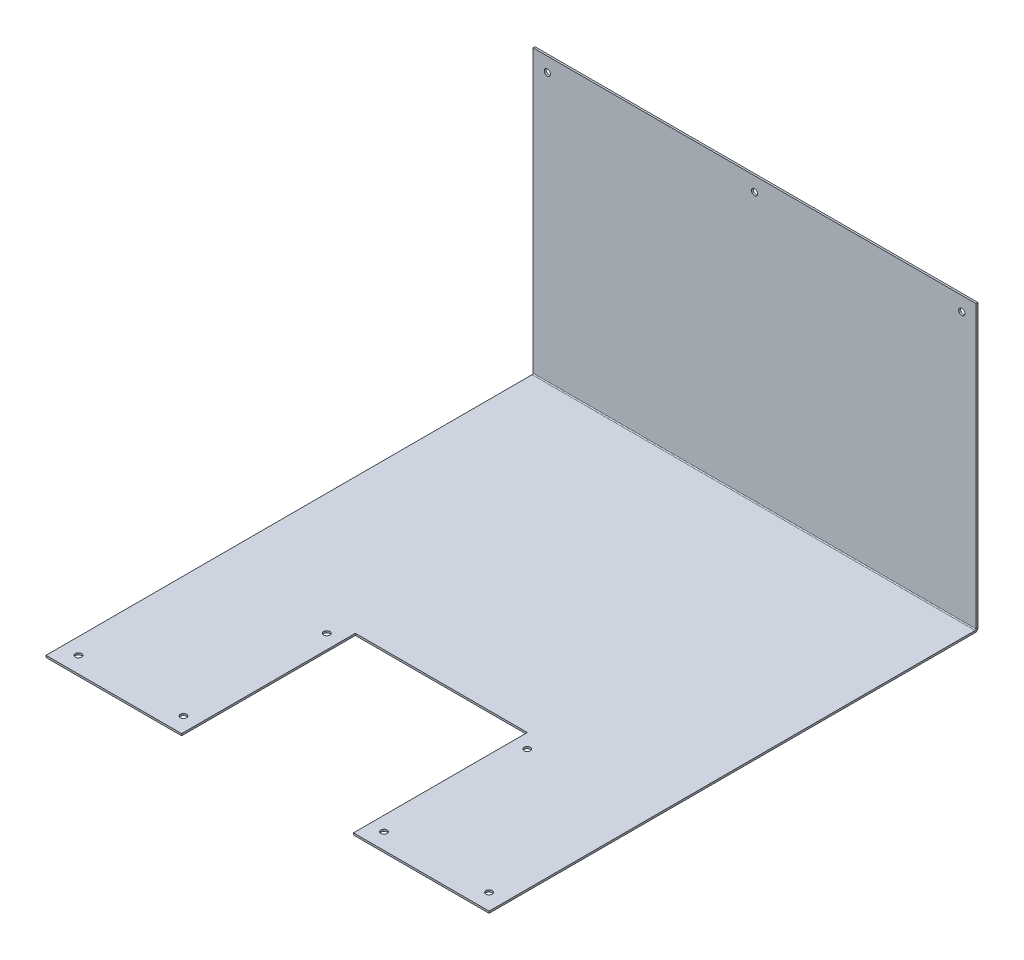
ISO-10303-21;
HEADER;
FILE_DESCRIPTION(('STEP AP214'),'2;1');
FILE_NAME('part.step','',(''),(''),'','','');
FILE_SCHEMA(('AUTOMOTIVE_DESIGN { 1 0 10303 214 1 1 1 1 }'));
ENDSEC;
DATA;
#1=APPLICATION_CONTEXT('core data for automotive mechanical design processes');
#2=APPLICATION_PROTOCOL_DEFINITION('international standard','automotive_design',2000,#1);
#3=PRODUCT_CONTEXT('',#1,'mechanical');
#4=PRODUCT('Part','Part','',(#3));
#5=PRODUCT_RELATED_PRODUCT_CATEGORY('part','',(#4));
#6=PRODUCT_DEFINITION_FORMATION('','',#4);
#7=PRODUCT_DEFINITION_CONTEXT('part definition',#1,'design');
#8=PRODUCT_DEFINITION('design','',#6,#7);
#9=PRODUCT_DEFINITION_SHAPE('','',#8);
#10=(LENGTH_UNIT() NAMED_UNIT(*) SI_UNIT(.MILLI.,.METRE.));
#11=(NAMED_UNIT(*) PLANE_ANGLE_UNIT() SI_UNIT($,.RADIAN.));
#12=(NAMED_UNIT(*) SI_UNIT($,.STERADIAN.) SOLID_ANGLE_UNIT());
#13=UNCERTAINTY_MEASURE_WITH_UNIT(LENGTH_MEASURE(1.E-05),#10,'distance_accuracy_value','');
#14=(GEOMETRIC_REPRESENTATION_CONTEXT(3) GLOBAL_UNCERTAINTY_ASSIGNED_CONTEXT((#13)) GLOBAL_UNIT_ASSIGNED_CONTEXT((#10,
#11,#12)) REPRESENTATION_CONTEXT('',''));
#15=CARTESIAN_POINT('',(0.,0.,0.));
#16=DIRECTION('',(0.,0.,1.));
#17=DIRECTION('',(1.,0.,0.));
#18=AXIS2_PLACEMENT_3D('',#15,#16,#17);
#19=CARTESIAN_POINT('',(232.,298.,-254.));
#20=DIRECTION('',(1.,0.,0.));
#21=DIRECTION('',(0.,-1.,0.));
#22=AXIS2_PLACEMENT_3D('',#19,#20,#21);
#23=PLANE('',#22);
#24=DIRECTION('',(0.,0.,1.));
#25=VECTOR('',#24,1.);
#26=CARTESIAN_POINT('',(232.,3.,-254.));
#27=LINE('',#26,#25);
#28=CARTESIAN_POINT('',(232.,3.00000000000004,-256.));
#29=VERTEX_POINT('',#28);
#30=CARTESIAN_POINT('',(232.,3.,-254.));
#31=VERTEX_POINT('',#30);
#32=EDGE_CURVE('E11',#29,#31,#27,.T.);
#33=ORIENTED_EDGE('',*,*,#32,.F.);
#34=DIRECTION('',(0.,1.,0.));
#35=VECTOR('',#34,1.);
#36=CARTESIAN_POINT('',(232.,298.,-256.));
#37=LINE('',#36,#35);
#38=CARTESIAN_POINT('',(232.,298.,-256.));
#39=VERTEX_POINT('',#38);
#40=EDGE_CURVE('E185',#39,#29,#37,.F.);
#41=ORIENTED_EDGE('',*,*,#40,.F.);
#42=DIRECTION('',(0.,0.,1.));
#43=VECTOR('',#42,1.);
#44=CARTESIAN_POINT('',(232.,298.,-254.));
#45=LINE('',#44,#43);
#46=CARTESIAN_POINT('',(232.,298.,-254.));
#47=VERTEX_POINT('',#46);
#48=EDGE_CURVE('E76',#39,#47,#45,.T.);
#49=ORIENTED_EDGE('',*,*,#48,.T.);
#50=DIRECTION('',(0.,-1.,0.));
#51=VECTOR('',#50,1.);
#52=CARTESIAN_POINT('',(232.,298.,-254.));
#53=LINE('',#52,#51);
#54=EDGE_CURVE('E206',#47,#31,#53,.T.);
#55=ORIENTED_EDGE('',*,*,#54,.T.);
#56=EDGE_LOOP('',(#33,#41,#49,#55));
#57=FACE_BOUND('',#56,.T.);
#58=ADVANCED_FACE('F46',(#57),#23,.T.);
#59=CARTESIAN_POINT('',(-232.,298.,-254.));
#60=DIRECTION('',(0.,1.,0.));
#61=DIRECTION('',(1.,0.,0.));
#62=AXIS2_PLACEMENT_3D('',#59,#60,#61);
#63=PLANE('',#62);
#64=ORIENTED_EDGE('',*,*,#48,.F.);
#65=DIRECTION('',(-1.,0.,0.));
#66=VECTOR('',#65,1.);
#67=CARTESIAN_POINT('',(-232.,298.,-256.));
#68=LINE('',#67,#66);
#69=CARTESIAN_POINT('',(-232.,298.,-256.));
#70=VERTEX_POINT('',#69);
#71=EDGE_CURVE('E198',#70,#39,#68,.F.);
#72=ORIENTED_EDGE('',*,*,#71,.F.);
#73=DIRECTION('',(0.,0.,1.));
#74=VECTOR('',#73,1.);
#75=CARTESIAN_POINT('',(-232.,298.,-254.));
#76=LINE('',#75,#74);
#77=CARTESIAN_POINT('',(-232.,298.,-254.));
#78=VERTEX_POINT('',#77);
#79=EDGE_CURVE('E64',#70,#78,#76,.T.);
#80=ORIENTED_EDGE('',*,*,#79,.T.);
#81=DIRECTION('',(1.,0.,0.));
#82=VECTOR('',#81,1.);
#83=CARTESIAN_POINT('',(-232.,298.,-254.));
#84=LINE('',#83,#82);
#85=EDGE_CURVE('E166',#78,#47,#84,.T.);
#86=ORIENTED_EDGE('',*,*,#85,.T.);
#87=EDGE_LOOP('',(#64,#72,#80,#86));
#88=FACE_BOUND('',#87,.T.);
#89=ADVANCED_FACE('F508',(#88),#63,.T.);
#90=CARTESIAN_POINT('',(-232.,298.,-254.));
#91=DIRECTION('',(1.,0.,0.));
#92=DIRECTION('',(0.,-1.,0.));
#93=AXIS2_PLACEMENT_3D('',#90,#91,#92);
#94=PLANE('',#93);
#95=ORIENTED_EDGE('',*,*,#79,.F.);
#96=DIRECTION('',(0.,1.,0.));
#97=VECTOR('',#96,1.);
#98=CARTESIAN_POINT('',(-232.,298.,-256.));
#99=LINE('',#98,#97);
#100=CARTESIAN_POINT('',(-232.,3.00000000000004,-256.));
#101=VERTEX_POINT('',#100);
#102=EDGE_CURVE('E170',#70,#101,#99,.F.);
#103=ORIENTED_EDGE('',*,*,#102,.T.);
#104=DIRECTION('',(0.,0.,1.));
#105=VECTOR('',#104,1.);
#106=CARTESIAN_POINT('',(-232.,3.,-254.));
#107=LINE('',#106,#105);
#108=CARTESIAN_POINT('',(-232.,3.00000000000001,-254.));
#109=VERTEX_POINT('',#108);
#110=EDGE_CURVE('E151',#101,#109,#107,.T.);
#111=ORIENTED_EDGE('',*,*,#110,.T.);
#112=DIRECTION('',(0.,-1.,0.));
#113=VECTOR('',#112,1.);
#114=CARTESIAN_POINT('',(-232.,298.,-254.));
#115=LINE('',#114,#113);
#116=EDGE_CURVE('E164',#78,#109,#115,.T.);
#117=ORIENTED_EDGE('',*,*,#116,.F.);
#118=EDGE_LOOP('',(#95,#103,#111,#117));
#119=FACE_BOUND('',#118,.T.);
#120=ADVANCED_FACE('F169',(#119),#94,.F.);
#121=CARTESIAN_POINT('',(217.,283.,-254.));
#122=DIRECTION('',(0.,0.,-1.));
#123=DIRECTION('',(-1.,0.,0.));
#124=AXIS2_PLACEMENT_3D('',#121,#122,#123);
#125=CYLINDRICAL_SURFACE('',#124,3.25000000000001);
#126=CARTESIAN_POINT('',(217.,283.,-254.));
#127=DIRECTION('',(0.,0.,-1.));
#128=DIRECTION('',(-1.,0.,0.));
#129=AXIS2_PLACEMENT_3D('',#126,#127,#128);
#130=CIRCLE('',#129,3.25000000000001);
#131=CARTESIAN_POINT('',(213.75,283.,-254.));
#132=VERTEX_POINT('',#131);
#133=EDGE_CURVE('E202',#132,#132,#130,.T.);
#134=ORIENTED_EDGE('',*,*,#133,.F.);
#135=EDGE_LOOP('',(#134));
#136=FACE_BOUND('',#135,.T.);
#137=CARTESIAN_POINT('',(217.,283.,-256.));
#138=DIRECTION('',(0.,0.,-1.));
#139=DIRECTION('',(-1.,0.,0.));
#140=AXIS2_PLACEMENT_3D('',#137,#138,#139);
#141=CIRCLE('',#140,3.25000000000001);
#142=CARTESIAN_POINT('',(213.75,283.,-256.));
#143=VERTEX_POINT('',#142);
#144=EDGE_CURVE('E190',#143,#143,#141,.T.);
#145=ORIENTED_EDGE('',*,*,#144,.T.);
#146=EDGE_LOOP('',(#145));
#147=FACE_BOUND('',#146,.T.);
#148=ADVANCED_FACE('F515',(#136,#147),#125,.F.);
#149=CARTESIAN_POINT('',(-217.,283.,-254.));
#150=DIRECTION('',(0.,0.,-1.));
#151=DIRECTION('',(-1.,0.,0.));
#152=AXIS2_PLACEMENT_3D('',#149,#150,#151);
#153=CYLINDRICAL_SURFACE('',#152,3.25000000000001);
#154=CARTESIAN_POINT('',(-217.,283.,-254.));
#155=DIRECTION('',(0.,0.,-1.));
#156=DIRECTION('',(-1.,0.,0.));
#157=AXIS2_PLACEMENT_3D('',#154,#155,#156);
#158=CIRCLE('',#157,3.25000000000001);
#159=CARTESIAN_POINT('',(-220.25,283.,-254.));
#160=VERTEX_POINT('',#159);
#161=EDGE_CURVE('E213',#160,#160,#158,.T.);
#162=ORIENTED_EDGE('',*,*,#161,.F.);
#163=EDGE_LOOP('',(#162));
#164=FACE_BOUND('',#163,.T.);
#165=CARTESIAN_POINT('',(-217.,283.,-256.));
#166=DIRECTION('',(0.,0.,-1.));
#167=DIRECTION('',(-1.,0.,0.));
#168=AXIS2_PLACEMENT_3D('',#165,#166,#167);
#169=CIRCLE('',#168,3.25000000000001);
#170=CARTESIAN_POINT('',(-220.25,283.,-256.));
#171=VERTEX_POINT('',#170);
#172=EDGE_CURVE('E186',#171,#171,#169,.T.);
#173=ORIENTED_EDGE('',*,*,#172,.T.);
#174=EDGE_LOOP('',(#173));
#175=FACE_BOUND('',#174,.T.);
#176=ADVANCED_FACE('F521',(#164,#175),#153,.F.);
#177=CARTESIAN_POINT('',(0.,283.,-254.));
#178=DIRECTION('',(0.,0.,-1.));
#179=DIRECTION('',(-1.,0.,0.));
#180=AXIS2_PLACEMENT_3D('',#177,#178,#179);
#181=CYLINDRICAL_SURFACE('',#180,3.25);
#182=CARTESIAN_POINT('',(0.,283.,-254.));
#183=DIRECTION('',(0.,0.,-1.));
#184=DIRECTION('',(-1.,0.,0.));
#185=AXIS2_PLACEMENT_3D('',#182,#183,#184);
#186=CIRCLE('',#185,3.25);
#187=CARTESIAN_POINT('',(-3.25,283.,-254.));
#188=VERTEX_POINT('',#187);
#189=EDGE_CURVE('E209',#188,#188,#186,.T.);
#190=ORIENTED_EDGE('',*,*,#189,.F.);
#191=EDGE_LOOP('',(#190));
#192=FACE_BOUND('',#191,.T.);
#193=CARTESIAN_POINT('',(0.,283.,-256.));
#194=DIRECTION('',(0.,0.,-1.));
#195=DIRECTION('',(-1.,0.,0.));
#196=AXIS2_PLACEMENT_3D('',#193,#194,#195);
#197=CIRCLE('',#196,3.25);
#198=CARTESIAN_POINT('',(-3.25,283.,-256.));
#199=VERTEX_POINT('',#198);
#200=EDGE_CURVE('E181',#199,#199,#197,.T.);
#201=ORIENTED_EDGE('',*,*,#200,.T.);
#202=EDGE_LOOP('',(#201));
#203=FACE_BOUND('',#202,.T.);
#204=ADVANCED_FACE('F48',(#192,#203),#181,.F.);
#205=CARTESIAN_POINT('',(-232.,298.,-254.));
#206=DIRECTION('',(0.,0.,-1.));
#207=DIRECTION('',(-1.,0.,0.));
#208=AXIS2_PLACEMENT_3D('',#205,#206,#207);
#209=PLANE('',#208);
#210=ORIENTED_EDGE('',*,*,#133,.T.);
#211=EDGE_LOOP('',(#210));
#212=FACE_BOUND('',#211,.T.);
#213=ORIENTED_EDGE('',*,*,#161,.T.);
#214=EDGE_LOOP('',(#213));
#215=FACE_BOUND('',#214,.T.);
#216=ORIENTED_EDGE('',*,*,#189,.T.);
#217=EDGE_LOOP('',(#216));
#218=FACE_BOUND('',#217,.T.);
#219=ORIENTED_EDGE('',*,*,#116,.T.);
#220=DIRECTION('',(1.,0.,0.));
#221=VECTOR('',#220,1.);
#222=CARTESIAN_POINT('',(232.,3.,-254.));
#223=LINE('',#222,#221);
#224=EDGE_CURVE('E142',#109,#31,#223,.T.);
#225=ORIENTED_EDGE('',*,*,#224,.T.);
#226=ORIENTED_EDGE('',*,*,#54,.F.);
#227=ORIENTED_EDGE('',*,*,#85,.F.);
#228=EDGE_LOOP('',(#219,#225,#226,#227));
#229=FACE_BOUND('',#228,.T.);
#230=ADVANCED_FACE('F165',(#212,#215,#218,#229),#209,.F.);
#231=CARTESIAN_POINT('',(-232.,298.,-256.));
#232=DIRECTION('',(0.,0.,-1.));
#233=DIRECTION('',(-1.,0.,0.));
#234=AXIS2_PLACEMENT_3D('',#231,#232,#233);
#235=PLANE('',#234);
#236=ORIENTED_EDGE('',*,*,#144,.F.);
#237=EDGE_LOOP('',(#236));
#238=FACE_BOUND('',#237,.T.);
#239=ORIENTED_EDGE('',*,*,#172,.F.);
#240=EDGE_LOOP('',(#239));
#241=FACE_BOUND('',#240,.T.);
#242=ORIENTED_EDGE('',*,*,#200,.F.);
#243=EDGE_LOOP('',(#242));
#244=FACE_BOUND('',#243,.T.);
#245=ORIENTED_EDGE('',*,*,#102,.F.);
#246=ORIENTED_EDGE('',*,*,#71,.T.);
#247=ORIENTED_EDGE('',*,*,#40,.T.);
#248=DIRECTION('',(1.,0.,0.));
#249=VECTOR('',#248,1.);
#250=CARTESIAN_POINT('',(-232.,3.,-256.));
#251=LINE('',#250,#249);
#252=EDGE_CURVE('E56',#101,#29,#251,.T.);
#253=ORIENTED_EDGE('',*,*,#252,.F.);
#254=EDGE_LOOP('',(#245,#246,#247,#253));
#255=FACE_BOUND('',#254,.T.);
#256=ADVANCED_FACE('F533',(#238,#241,#244,#255),#235,.T.);
#257=CARTESIAN_POINT('',(-232.,2.,256.));
#258=DIRECTION('',(0.,0.,-1.));
#259=DIRECTION('',(1.,0.,0.));
#260=AXIS2_PLACEMENT_3D('',#257,#258,#259);
#261=PLANE('',#260);
#262=DIRECTION('',(0.,1.,0.));
#263=VECTOR('',#262,1.);
#264=CARTESIAN_POINT('',(90.,2.,256.));
#265=LINE('',#264,#263);
#266=CARTESIAN_POINT('',(90.,0.,256.));
#267=VERTEX_POINT('',#266);
#268=CARTESIAN_POINT('',(90.,2.,256.));
#269=VERTEX_POINT('',#268);
#270=EDGE_CURVE('E236',#267,#269,#265,.T.);
#271=ORIENTED_EDGE('',*,*,#270,.F.);
#272=DIRECTION('',(1.,0.,0.));
#273=VECTOR('',#272,1.);
#274=CARTESIAN_POINT('',(0.,0.,256.));
#275=LINE('',#274,#273);
#276=CARTESIAN_POINT('',(232.,0.,256.));
#277=VERTEX_POINT('',#276);
#278=EDGE_CURVE('E225',#267,#277,#275,.T.);
#279=ORIENTED_EDGE('',*,*,#278,.T.);
#280=DIRECTION('',(0.,1.,0.));
#281=VECTOR('',#280,1.);
#282=CARTESIAN_POINT('',(232.,2.,256.));
#283=LINE('',#282,#281);
#284=CARTESIAN_POINT('',(232.,2.,256.));
#285=VERTEX_POINT('',#284);
#286=EDGE_CURVE('E229',#277,#285,#283,.T.);
#287=ORIENTED_EDGE('',*,*,#286,.T.);
#288=DIRECTION('',(1.,0.,0.));
#289=VECTOR('',#288,1.);
#290=CARTESIAN_POINT('',(-232.,2.,256.));
#291=LINE('',#290,#289);
#292=EDGE_CURVE('E332',#269,#285,#291,.T.);
#293=ORIENTED_EDGE('',*,*,#292,.F.);
#294=EDGE_LOOP('',(#271,#279,#287,#293));
#295=FACE_BOUND('',#294,.T.);
#296=ADVANCED_FACE('F493',(#295),#261,.F.);
#297=CARTESIAN_POINT('',(90.,2.,0.));
#298=DIRECTION('',(1.,0.,0.));
#299=DIRECTION('',(0.,0.,1.));
#300=AXIS2_PLACEMENT_3D('',#297,#298,#299);
#301=PLANE('',#300);
#302=DIRECTION('',(0.,1.,0.));
#303=VECTOR('',#302,1.);
#304=CARTESIAN_POINT('',(90.,2.,74.));
#305=LINE('',#304,#303);
#306=CARTESIAN_POINT('',(90.,0.,74.));
#307=VERTEX_POINT('',#306);
#308=CARTESIAN_POINT('',(90.,2.,74.));
#309=VERTEX_POINT('',#308);
#310=EDGE_CURVE('E243',#307,#309,#305,.T.);
#311=ORIENTED_EDGE('',*,*,#310,.F.);
#312=DIRECTION('',(0.,0.,-1.));
#313=VECTOR('',#312,1.);
#314=CARTESIAN_POINT('',(90.,0.,0.));
#315=LINE('',#314,#313);
#316=EDGE_CURVE('E232',#307,#267,#315,.F.);
#317=ORIENTED_EDGE('',*,*,#316,.T.);
#318=ORIENTED_EDGE('',*,*,#270,.T.);
#319=DIRECTION('',(0.,0.,1.));
#320=VECTOR('',#319,1.);
#321=CARTESIAN_POINT('',(90.,2.,0.));
#322=LINE('',#321,#320);
#323=EDGE_CURVE('E328',#309,#269,#322,.T.);
#324=ORIENTED_EDGE('',*,*,#323,.F.);
#325=EDGE_LOOP('',(#311,#317,#318,#324));
#326=FACE_BOUND('',#325,.T.);
#327=ADVANCED_FACE('F489',(#326),#301,.F.);
#328=CARTESIAN_POINT('',(0.,2.,74.));
#329=DIRECTION('',(0.,0.,-1.));
#330=DIRECTION('',(1.,0.,0.));
#331=AXIS2_PLACEMENT_3D('',#328,#329,#330);
#332=PLANE('',#331);
#333=DIRECTION('',(0.,1.,0.));
#334=VECTOR('',#333,1.);
#335=CARTESIAN_POINT('',(-90.,2.,74.));
#336=LINE('',#335,#334);
#337=CARTESIAN_POINT('',(-90.,0.,74.));
#338=VERTEX_POINT('',#337);
#339=CARTESIAN_POINT('',(-90.,2.,74.));
#340=VERTEX_POINT('',#339);
#341=EDGE_CURVE('E250',#338,#340,#336,.T.);
#342=ORIENTED_EDGE('',*,*,#341,.F.);
#343=DIRECTION('',(1.,0.,0.));
#344=VECTOR('',#343,1.);
#345=CARTESIAN_POINT('',(0.,0.,74.));
#346=LINE('',#345,#344);
#347=EDGE_CURVE('E239',#338,#307,#346,.T.);
#348=ORIENTED_EDGE('',*,*,#347,.T.);
#349=ORIENTED_EDGE('',*,*,#310,.T.);
#350=DIRECTION('',(1.,0.,0.));
#351=VECTOR('',#350,1.);
#352=CARTESIAN_POINT('',(0.,2.,74.));
#353=LINE('',#352,#351);
#354=EDGE_CURVE('E324',#340,#309,#353,.T.);
#355=ORIENTED_EDGE('',*,*,#354,.F.);
#356=EDGE_LOOP('',(#342,#348,#349,#355));
#357=FACE_BOUND('',#356,.T.);
#358=ADVANCED_FACE('F485',(#357),#332,.F.);
#359=CARTESIAN_POINT('',(-90.,2.,0.));
#360=DIRECTION('',(-1.,0.,0.));
#361=DIRECTION('',(0.,0.,-1.));
#362=AXIS2_PLACEMENT_3D('',#359,#360,#361);
#363=PLANE('',#362);
#364=DIRECTION('',(0.,1.,0.));
#365=VECTOR('',#364,1.);
#366=CARTESIAN_POINT('',(-90.,2.,256.));
#367=LINE('',#366,#365);
#368=CARTESIAN_POINT('',(-90.,0.,256.));
#369=VERTEX_POINT('',#368);
#370=CARTESIAN_POINT('',(-90.,2.,256.));
#371=VERTEX_POINT('',#370);
#372=EDGE_CURVE('E257',#369,#371,#367,.T.);
#373=ORIENTED_EDGE('',*,*,#372,.F.);
#374=DIRECTION('',(0.,0.,-1.));
#375=VECTOR('',#374,1.);
#376=CARTESIAN_POINT('',(-90.,0.,0.));
#377=LINE('',#376,#375);
#378=EDGE_CURVE('E246',#369,#338,#377,.T.);
#379=ORIENTED_EDGE('',*,*,#378,.T.);
#380=ORIENTED_EDGE('',*,*,#341,.T.);
#381=DIRECTION('',(0.,0.,-1.));
#382=VECTOR('',#381,1.);
#383=CARTESIAN_POINT('',(-90.,2.,0.));
#384=LINE('',#383,#382);
#385=EDGE_CURVE('E320',#371,#340,#384,.T.);
#386=ORIENTED_EDGE('',*,*,#385,.F.);
#387=EDGE_LOOP('',(#373,#379,#380,#386));
#388=FACE_BOUND('',#387,.T.);
#389=ADVANCED_FACE('F480',(#388),#363,.F.);
#390=DIRECTION('',(0.,1.,0.));
#391=VECTOR('',#390,1.);
#392=CARTESIAN_POINT('',(-232.,2.,256.));
#393=LINE('',#392,#391);
#394=CARTESIAN_POINT('',(-232.,0.,256.));
#395=VERTEX_POINT('',#394);
#396=CARTESIAN_POINT('',(-232.,2.,256.));
#397=VERTEX_POINT('',#396);
#398=EDGE_CURVE('E340',#395,#397,#393,.T.);
#399=ORIENTED_EDGE('',*,*,#398,.F.);
#400=DIRECTION('',(1.,0.,0.));
#401=VECTOR('',#400,1.);
#402=CARTESIAN_POINT('',(0.,0.,256.));
#403=LINE('',#402,#401);
#404=EDGE_CURVE('E253',#395,#369,#403,.T.);
#405=ORIENTED_EDGE('',*,*,#404,.T.);
#406=ORIENTED_EDGE('',*,*,#372,.T.);
#407=EDGE_CURVE('E319',#397,#371,#291,.T.);
#408=ORIENTED_EDGE('',*,*,#407,.F.);
#409=EDGE_LOOP('',(#399,#405,#406,#408));
#410=FACE_BOUND('',#409,.T.);
#411=ADVANCED_FACE('F554',(#410),#261,.F.);
#412=CARTESIAN_POINT('',(-105.,-8.,89.));
#413=DIRECTION('',(0.,1.,0.));
#414=DIRECTION('',(0.,0.,1.));
#415=AXIS2_PLACEMENT_3D('',#412,#413,#414);
#416=CYLINDRICAL_SURFACE('',#415,3.25000000000001);
#417=CARTESIAN_POINT('',(-105.,0.,89.));
#418=DIRECTION('',(0.,-1.,0.));
#419=DIRECTION('',(0.,0.,-1.));
#420=AXIS2_PLACEMENT_3D('',#417,#418,#419);
#421=CIRCLE('',#420,3.25000000000001);
#422=CARTESIAN_POINT('',(-105.,0.,85.75));
#423=VERTEX_POINT('',#422);
#424=EDGE_CURVE('E260',#423,#423,#421,.T.);
#425=ORIENTED_EDGE('',*,*,#424,.T.);
#426=EDGE_LOOP('',(#425));
#427=FACE_BOUND('',#426,.T.);
#428=CARTESIAN_POINT('',(-105.,2.,89.));
#429=DIRECTION('',(0.,1.,0.));
#430=DIRECTION('',(0.,0.,1.));
#431=AXIS2_PLACEMENT_3D('',#428,#429,#430);
#432=CIRCLE('',#431,3.25000000000001);
#433=CARTESIAN_POINT('',(-105.,2.,92.25));
#434=VERTEX_POINT('',#433);
#435=EDGE_CURVE('E264',#434,#434,#432,.T.);
#436=ORIENTED_EDGE('',*,*,#435,.T.);
#437=EDGE_LOOP('',(#436));
#438=FACE_BOUND('',#437,.T.);
#439=ADVANCED_FACE('F561',(#427,#438),#416,.F.);
#440=CARTESIAN_POINT('',(105.,-8.,239.));
#441=DIRECTION('',(0.,1.,0.));
#442=DIRECTION('',(0.,0.,1.));
#443=AXIS2_PLACEMENT_3D('',#440,#441,#442);
#444=CYLINDRICAL_SURFACE('',#443,3.25000000000001);
#445=CARTESIAN_POINT('',(105.,0.,239.));
#446=DIRECTION('',(0.,-1.,0.));
#447=DIRECTION('',(0.,0.,-1.));
#448=AXIS2_PLACEMENT_3D('',#445,#446,#447);
#449=CIRCLE('',#448,3.25000000000001);
#450=CARTESIAN_POINT('',(105.,0.,235.75));
#451=VERTEX_POINT('',#450);
#452=EDGE_CURVE('E268',#451,#451,#449,.T.);
#453=ORIENTED_EDGE('',*,*,#452,.T.);
#454=EDGE_LOOP('',(#453));
#455=FACE_BOUND('',#454,.T.);
#456=CARTESIAN_POINT('',(105.,2.,239.));
#457=DIRECTION('',(0.,1.,0.));
#458=DIRECTION('',(0.,0.,-1.));
#459=AXIS2_PLACEMENT_3D('',#456,#457,#458);
#460=CIRCLE('',#459,3.25000000000001);
#461=CARTESIAN_POINT('',(105.,2.,235.75));
#462=VERTEX_POINT('',#461);
#463=EDGE_CURVE('E272',#462,#462,#460,.T.);
#464=ORIENTED_EDGE('',*,*,#463,.T.);
#465=EDGE_LOOP('',(#464));
#466=FACE_BOUND('',#465,.T.);
#467=ADVANCED_FACE('F564',(#455,#466),#444,.F.);
#468=CARTESIAN_POINT('',(-105.,-8.,239.));
#469=DIRECTION('',(0.,1.,0.));
#470=DIRECTION('',(0.,0.,1.));
#471=AXIS2_PLACEMENT_3D('',#468,#469,#470);
#472=CYLINDRICAL_SURFACE('',#471,3.25000000000001);
#473=CARTESIAN_POINT('',(-105.,0.,239.));
#474=DIRECTION('',(0.,-1.,0.));
#475=DIRECTION('',(0.,0.,-1.));
#476=AXIS2_PLACEMENT_3D('',#473,#474,#475);
#477=CIRCLE('',#476,3.25000000000001);
#478=CARTESIAN_POINT('',(-105.,0.,235.75));
#479=VERTEX_POINT('',#478);
#480=EDGE_CURVE('E276',#479,#479,#477,.T.);
#481=ORIENTED_EDGE('',*,*,#480,.T.);
#482=EDGE_LOOP('',(#481));
#483=FACE_BOUND('',#482,.T.);
#484=CARTESIAN_POINT('',(-105.,2.,239.));
#485=DIRECTION('',(0.,1.,0.));
#486=DIRECTION('',(0.,0.,1.));
#487=AXIS2_PLACEMENT_3D('',#484,#485,#486);
#488=CIRCLE('',#487,3.25000000000001);
#489=CARTESIAN_POINT('',(-105.,2.,242.25));
#490=VERTEX_POINT('',#489);
#491=EDGE_CURVE('E280',#490,#490,#488,.T.);
#492=ORIENTED_EDGE('',*,*,#491,.T.);
#493=EDGE_LOOP('',(#492));
#494=FACE_BOUND('',#493,.T.);
#495=ADVANCED_FACE('F568',(#483,#494),#472,.F.);
#496=CARTESIAN_POINT('',(215.,-8.,239.));
#497=DIRECTION('',(0.,1.,0.));
#498=DIRECTION('',(0.,0.,1.));
#499=AXIS2_PLACEMENT_3D('',#496,#497,#498);
#500=CYLINDRICAL_SURFACE('',#499,3.25000000000001);
#501=CARTESIAN_POINT('',(215.,0.,239.));
#502=DIRECTION('',(0.,-1.,0.));
#503=DIRECTION('',(0.,0.,-1.));
#504=AXIS2_PLACEMENT_3D('',#501,#502,#503);
#505=CIRCLE('',#504,3.25000000000001);
#506=CARTESIAN_POINT('',(215.,0.,235.75));
#507=VERTEX_POINT('',#506);
#508=EDGE_CURVE('E284',#507,#507,#505,.T.);
#509=ORIENTED_EDGE('',*,*,#508,.T.);
#510=EDGE_LOOP('',(#509));
#511=FACE_BOUND('',#510,.T.);
#512=CARTESIAN_POINT('',(215.,2.,239.));
#513=DIRECTION('',(0.,1.,0.));
#514=DIRECTION('',(0.,0.,-1.));
#515=AXIS2_PLACEMENT_3D('',#512,#513,#514);
#516=CIRCLE('',#515,3.25000000000001);
#517=CARTESIAN_POINT('',(215.,2.,235.75));
#518=VERTEX_POINT('',#517);
#519=EDGE_CURVE('E288',#518,#518,#516,.T.);
#520=ORIENTED_EDGE('',*,*,#519,.T.);
#521=EDGE_LOOP('',(#520));
#522=FACE_BOUND('',#521,.T.);
#523=ADVANCED_FACE('F572',(#511,#522),#500,.F.);
#524=CARTESIAN_POINT('',(105.,-8.,89.));
#525=DIRECTION('',(0.,1.,0.));
#526=DIRECTION('',(0.,0.,1.));
#527=AXIS2_PLACEMENT_3D('',#524,#525,#526);
#528=CYLINDRICAL_SURFACE('',#527,3.25000000000001);
#529=CARTESIAN_POINT('',(105.,0.,89.));
#530=DIRECTION('',(0.,-1.,0.));
#531=DIRECTION('',(0.,0.,-1.));
#532=AXIS2_PLACEMENT_3D('',#529,#530,#531);
#533=CIRCLE('',#532,3.25000000000001);
#534=CARTESIAN_POINT('',(105.,0.,85.75));
#535=VERTEX_POINT('',#534);
#536=EDGE_CURVE('E292',#535,#535,#533,.T.);
#537=ORIENTED_EDGE('',*,*,#536,.T.);
#538=EDGE_LOOP('',(#537));
#539=FACE_BOUND('',#538,.T.);
#540=CARTESIAN_POINT('',(105.,2.,89.));
#541=DIRECTION('',(0.,1.,0.));
#542=DIRECTION('',(0.,0.,-1.));
#543=AXIS2_PLACEMENT_3D('',#540,#541,#542);
#544=CIRCLE('',#543,3.25000000000001);
#545=CARTESIAN_POINT('',(105.,2.,85.75));
#546=VERTEX_POINT('',#545);
#547=EDGE_CURVE('E296',#546,#546,#544,.T.);
#548=ORIENTED_EDGE('',*,*,#547,.T.);
#549=EDGE_LOOP('',(#548));
#550=FACE_BOUND('',#549,.T.);
#551=ADVANCED_FACE('F576',(#539,#550),#528,.F.);
#552=CARTESIAN_POINT('',(-215.,-8.,239.));
#553=DIRECTION('',(0.,1.,0.));
#554=DIRECTION('',(0.,0.,1.));
#555=AXIS2_PLACEMENT_3D('',#552,#553,#554);
#556=CYLINDRICAL_SURFACE('',#555,3.25000000000001);
#557=CARTESIAN_POINT('',(-215.,0.,239.));
#558=DIRECTION('',(0.,-1.,0.));
#559=DIRECTION('',(0.,0.,-1.));
#560=AXIS2_PLACEMENT_3D('',#557,#558,#559);
#561=CIRCLE('',#560,3.25000000000001);
#562=CARTESIAN_POINT('',(-215.,0.,235.75));
#563=VERTEX_POINT('',#562);
#564=EDGE_CURVE('E300',#563,#563,#561,.T.);
#565=ORIENTED_EDGE('',*,*,#564,.T.);
#566=EDGE_LOOP('',(#565));
#567=FACE_BOUND('',#566,.T.);
#568=CARTESIAN_POINT('',(-215.,2.,239.));
#569=DIRECTION('',(0.,1.,0.));
#570=DIRECTION('',(0.,0.,1.));
#571=AXIS2_PLACEMENT_3D('',#568,#569,#570);
#572=CIRCLE('',#571,3.25000000000001);
#573=CARTESIAN_POINT('',(-215.,2.,242.25));
#574=VERTEX_POINT('',#573);
#575=EDGE_CURVE('E304',#574,#574,#572,.T.);
#576=ORIENTED_EDGE('',*,*,#575,.T.);
#577=EDGE_LOOP('',(#576));
#578=FACE_BOUND('',#577,.T.);
#579=ADVANCED_FACE('F580',(#567,#578),#556,.F.);
#580=CARTESIAN_POINT('',(0.,2.,0.));
#581=DIRECTION('',(0.,-1.,0.));
#582=DIRECTION('',(0.,0.,-1.));
#583=AXIS2_PLACEMENT_3D('',#580,#581,#582);
#584=PLANE('',#583);
#585=ORIENTED_EDGE('',*,*,#575,.F.);
#586=EDGE_LOOP('',(#585));
#587=FACE_BOUND('',#586,.T.);
#588=ORIENTED_EDGE('',*,*,#547,.F.);
#589=EDGE_LOOP('',(#588));
#590=FACE_BOUND('',#589,.T.);
#591=ORIENTED_EDGE('',*,*,#519,.F.);
#592=EDGE_LOOP('',(#591));
#593=FACE_BOUND('',#592,.T.);
#594=ORIENTED_EDGE('',*,*,#491,.F.);
#595=EDGE_LOOP('',(#594));
#596=FACE_BOUND('',#595,.T.);
#597=ORIENTED_EDGE('',*,*,#463,.F.);
#598=EDGE_LOOP('',(#597));
#599=FACE_BOUND('',#598,.T.);
#600=ORIENTED_EDGE('',*,*,#435,.F.);
#601=EDGE_LOOP('',(#600));
#602=FACE_BOUND('',#601,.T.);
#603=DIRECTION('',(0.,0.,-1.));
#604=VECTOR('',#603,1.);
#605=CARTESIAN_POINT('',(232.,2.,256.));
#606=LINE('',#605,#604);
#607=CARTESIAN_POINT('',(232.,2.,-253.));
#608=VERTEX_POINT('',#607);
#609=EDGE_CURVE('E308',#285,#608,#606,.T.);
#610=ORIENTED_EDGE('',*,*,#609,.T.);
#611=DIRECTION('',(-1.,0.,0.));
#612=VECTOR('',#611,1.);
#613=CARTESIAN_POINT('',(-232.,2.,-253.));
#614=LINE('',#613,#612);
#615=CARTESIAN_POINT('',(-232.,2.,-253.));
#616=VERTEX_POINT('',#615);
#617=EDGE_CURVE('E311',#608,#616,#614,.T.);
#618=ORIENTED_EDGE('',*,*,#617,.T.);
#619=DIRECTION('',(0.,0.,1.));
#620=VECTOR('',#619,1.);
#621=CARTESIAN_POINT('',(-232.,2.,256.));
#622=LINE('',#621,#620);
#623=EDGE_CURVE('E315',#616,#397,#622,.T.);
#624=ORIENTED_EDGE('',*,*,#623,.T.);
#625=ORIENTED_EDGE('',*,*,#407,.T.);
#626=ORIENTED_EDGE('',*,*,#385,.T.);
#627=ORIENTED_EDGE('',*,*,#354,.T.);
#628=ORIENTED_EDGE('',*,*,#323,.T.);
#629=ORIENTED_EDGE('',*,*,#292,.T.);
#630=EDGE_LOOP('',(#610,#618,#624,#625,#626,#627,#628,#629));
#631=FACE_BOUND('',#630,.T.);
#632=ADVANCED_FACE('F477',(#587,#590,#593,#596,#599,#602,#631),#584,.F.);
#633=CARTESIAN_POINT('',(-232.,2.,256.));
#634=DIRECTION('',(1.,0.,0.));
#635=DIRECTION('',(0.,0.,1.));
#636=AXIS2_PLACEMENT_3D('',#633,#634,#635);
#637=PLANE('',#636);
#638=DIRECTION('',(0.,1.,0.));
#639=VECTOR('',#638,1.);
#640=CARTESIAN_POINT('',(-232.,2.,-253.));
#641=LINE('',#640,#639);
#642=CARTESIAN_POINT('',(-232.,0.,-253.));
#643=VERTEX_POINT('',#642);
#644=EDGE_CURVE('E160',#643,#616,#641,.T.);
#645=ORIENTED_EDGE('',*,*,#644,.F.);
#646=DIRECTION('',(0.,0.,-1.));
#647=VECTOR('',#646,1.);
#648=CARTESIAN_POINT('',(-232.,0.,0.));
#649=LINE('',#648,#647);
#650=EDGE_CURVE('E336',#643,#395,#649,.F.);
#651=ORIENTED_EDGE('',*,*,#650,.T.);
#652=ORIENTED_EDGE('',*,*,#398,.T.);
#653=ORIENTED_EDGE('',*,*,#623,.F.);
#654=EDGE_LOOP('',(#645,#651,#652,#653));
#655=FACE_BOUND('',#654,.T.);
#656=ADVANCED_FACE('F587',(#655),#637,.F.);
#657=CARTESIAN_POINT('',(0.,0.,0.));
#658=DIRECTION('',(0.,-1.,0.));
#659=DIRECTION('',(0.,0.,-1.));
#660=AXIS2_PLACEMENT_3D('',#657,#658,#659);
#661=PLANE('',#660);
#662=ORIENTED_EDGE('',*,*,#564,.F.);
#663=EDGE_LOOP('',(#662));
#664=FACE_BOUND('',#663,.T.);
#665=ORIENTED_EDGE('',*,*,#536,.F.);
#666=EDGE_LOOP('',(#665));
#667=FACE_BOUND('',#666,.T.);
#668=ORIENTED_EDGE('',*,*,#508,.F.);
#669=EDGE_LOOP('',(#668));
#670=FACE_BOUND('',#669,.T.);
#671=ORIENTED_EDGE('',*,*,#480,.F.);
#672=EDGE_LOOP('',(#671));
#673=FACE_BOUND('',#672,.T.);
#674=ORIENTED_EDGE('',*,*,#452,.F.);
#675=EDGE_LOOP('',(#674));
#676=FACE_BOUND('',#675,.T.);
#677=ORIENTED_EDGE('',*,*,#424,.F.);
#678=EDGE_LOOP('',(#677));
#679=FACE_BOUND('',#678,.T.);
#680=DIRECTION('',(0.,0.,-1.));
#681=VECTOR('',#680,1.);
#682=CARTESIAN_POINT('',(232.,0.,0.));
#683=LINE('',#682,#681);
#684=CARTESIAN_POINT('',(232.,0.,-253.));
#685=VERTEX_POINT('',#684);
#686=EDGE_CURVE('E343',#277,#685,#683,.T.);
#687=ORIENTED_EDGE('',*,*,#686,.F.);
#688=ORIENTED_EDGE('',*,*,#278,.F.);
#689=ORIENTED_EDGE('',*,*,#316,.F.);
#690=ORIENTED_EDGE('',*,*,#347,.F.);
#691=ORIENTED_EDGE('',*,*,#378,.F.);
#692=ORIENTED_EDGE('',*,*,#404,.F.);
#693=ORIENTED_EDGE('',*,*,#650,.F.);
#694=DIRECTION('',(-1.,0.,0.));
#695=VECTOR('',#694,1.);
#696=CARTESIAN_POINT('',(0.,0.,-253.));
#697=LINE('',#696,#695);
#698=EDGE_CURVE('E162',#685,#643,#697,.T.);
#699=ORIENTED_EDGE('',*,*,#698,.F.);
#700=EDGE_LOOP('',(#687,#688,#689,#690,#691,#692,#693,#699));
#701=FACE_BOUND('',#700,.T.);
#702=ADVANCED_FACE('F496',(#664,#667,#670,#673,#676,#679,#701),#661,.T.);
#703=CARTESIAN_POINT('',(232.,2.,256.));
#704=DIRECTION('',(-1.,0.,0.));
#705=DIRECTION('',(0.,0.,-1.));
#706=AXIS2_PLACEMENT_3D('',#703,#704,#705);
#707=PLANE('',#706);
#708=ORIENTED_EDGE('',*,*,#286,.F.);
#709=ORIENTED_EDGE('',*,*,#686,.T.);
#710=DIRECTION('',(0.,1.,0.));
#711=VECTOR('',#710,1.);
#712=CARTESIAN_POINT('',(232.,2.,-253.));
#713=LINE('',#712,#711);
#714=EDGE_CURVE('E194',#685,#608,#713,.T.);
#715=ORIENTED_EDGE('',*,*,#714,.T.);
#716=ORIENTED_EDGE('',*,*,#609,.F.);
#717=EDGE_LOOP('',(#708,#709,#715,#716));
#718=FACE_BOUND('',#717,.T.);
#719=ADVANCED_FACE('F500',(#718),#707,.F.);
#720=CARTESIAN_POINT('',(232.,3.,-253.));
#721=DIRECTION('',(-1.,0.,0.));
#722=DIRECTION('',(0.,0.,1.));
#723=AXIS2_PLACEMENT_3D('',#720,#721,#722);
#724=PLANE('',#723);
#725=ORIENTED_EDGE('',*,*,#714,.F.);
#726=CARTESIAN_POINT('',(232.,3.,-253.));
#727=DIRECTION('',(-1.,0.,0.));
#728=DIRECTION('',(0.,0.,1.));
#729=AXIS2_PLACEMENT_3D('',#726,#727,#728);
#730=CIRCLE('',#729,3.);
#731=EDGE_CURVE('E349',#685,#29,#730,.F.);
#732=ORIENTED_EDGE('',*,*,#731,.T.);
#733=ORIENTED_EDGE('',*,*,#32,.T.);
#734=CARTESIAN_POINT('',(232.,3.,-253.));
#735=DIRECTION('',(1.,0.,0.));
#736=DIRECTION('',(0.,0.,-1.));
#737=AXIS2_PLACEMENT_3D('',#734,#735,#736);
#738=CIRCLE('',#737,1.);
#739=EDGE_CURVE('E84',#608,#31,#738,.T.);
#740=ORIENTED_EDGE('',*,*,#739,.F.);
#741=EDGE_LOOP('',(#725,#732,#733,#740));
#742=FACE_BOUND('',#741,.T.);
#743=ADVANCED_FACE('F504',(#742),#724,.F.);
#744=CARTESIAN_POINT('',(-232.,3.,-253.));
#745=DIRECTION('',(1.,0.,0.));
#746=DIRECTION('',(0.,0.,-1.));
#747=AXIS2_PLACEMENT_3D('',#744,#745,#746);
#748=PLANE('',#747);
#749=ORIENTED_EDGE('',*,*,#110,.F.);
#750=CARTESIAN_POINT('',(-232.,3.,-253.));
#751=DIRECTION('',(-1.,0.,0.));
#752=DIRECTION('',(0.,0.,1.));
#753=AXIS2_PLACEMENT_3D('',#750,#751,#752);
#754=CIRCLE('',#753,3.);
#755=EDGE_CURVE('E353',#101,#643,#754,.T.);
#756=ORIENTED_EDGE('',*,*,#755,.T.);
#757=ORIENTED_EDGE('',*,*,#644,.T.);
#758=CARTESIAN_POINT('',(-232.,3.,-253.));
#759=DIRECTION('',(-1.,0.,0.));
#760=DIRECTION('',(0.,0.,1.));
#761=AXIS2_PLACEMENT_3D('',#758,#759,#760);
#762=CIRCLE('',#761,1.);
#763=EDGE_CURVE('E145',#109,#616,#762,.T.);
#764=ORIENTED_EDGE('',*,*,#763,.F.);
#765=EDGE_LOOP('',(#749,#756,#757,#764));
#766=FACE_BOUND('',#765,.T.);
#767=ADVANCED_FACE('F155',(#766),#748,.F.);
#768=CARTESIAN_POINT('',(464.014945453701,3.,-253.));
#769=DIRECTION('',(-1.,0.,0.));
#770=DIRECTION('',(0.,0.,1.));
#771=AXIS2_PLACEMENT_3D('',#768,#769,#770);
#772=CYLINDRICAL_SURFACE('',#771,1.);
#773=ORIENTED_EDGE('',*,*,#763,.T.);
#774=ORIENTED_EDGE('',*,*,#617,.F.);
#775=ORIENTED_EDGE('',*,*,#739,.T.);
#776=ORIENTED_EDGE('',*,*,#224,.F.);
#777=EDGE_LOOP('',(#773,#774,#775,#776));
#778=FACE_BOUND('',#777,.T.);
#779=ADVANCED_FACE('F144',(#778),#772,.F.);
#780=CARTESIAN_POINT('',(464.014945453701,3.,-253.));
#781=DIRECTION('',(-1.,0.,0.));
#782=DIRECTION('',(0.,0.,1.));
#783=AXIS2_PLACEMENT_3D('',#780,#781,#782);
#784=CYLINDRICAL_SURFACE('',#783,3.);
#785=ORIENTED_EDGE('',*,*,#755,.F.);
#786=ORIENTED_EDGE('',*,*,#252,.T.);
#787=ORIENTED_EDGE('',*,*,#731,.F.);
#788=ORIENTED_EDGE('',*,*,#698,.T.);
#789=EDGE_LOOP('',(#785,#786,#787,#788));
#790=FACE_BOUND('',#789,.T.);
#791=ADVANCED_FACE('F540',(#790),#784,.T.);
#792=CLOSED_SHELL('',(#58,#89,#120,#148,#176,#204,#230,#256,#296,#327,#358,#389,#411,#439,#467,
#495,#523,#551,#579,#632,#656,#702,#719,#743,#767,#779,#791));
#793=MANIFOLD_SOLID_BREP('B2',#792);
#794=ADVANCED_BREP_SHAPE_REPRESENTATION('',(#18,#793),#14);
#795=SHAPE_DEFINITION_REPRESENTATION(#9,#794);
ENDSEC;
END-ISO-10303-21;
